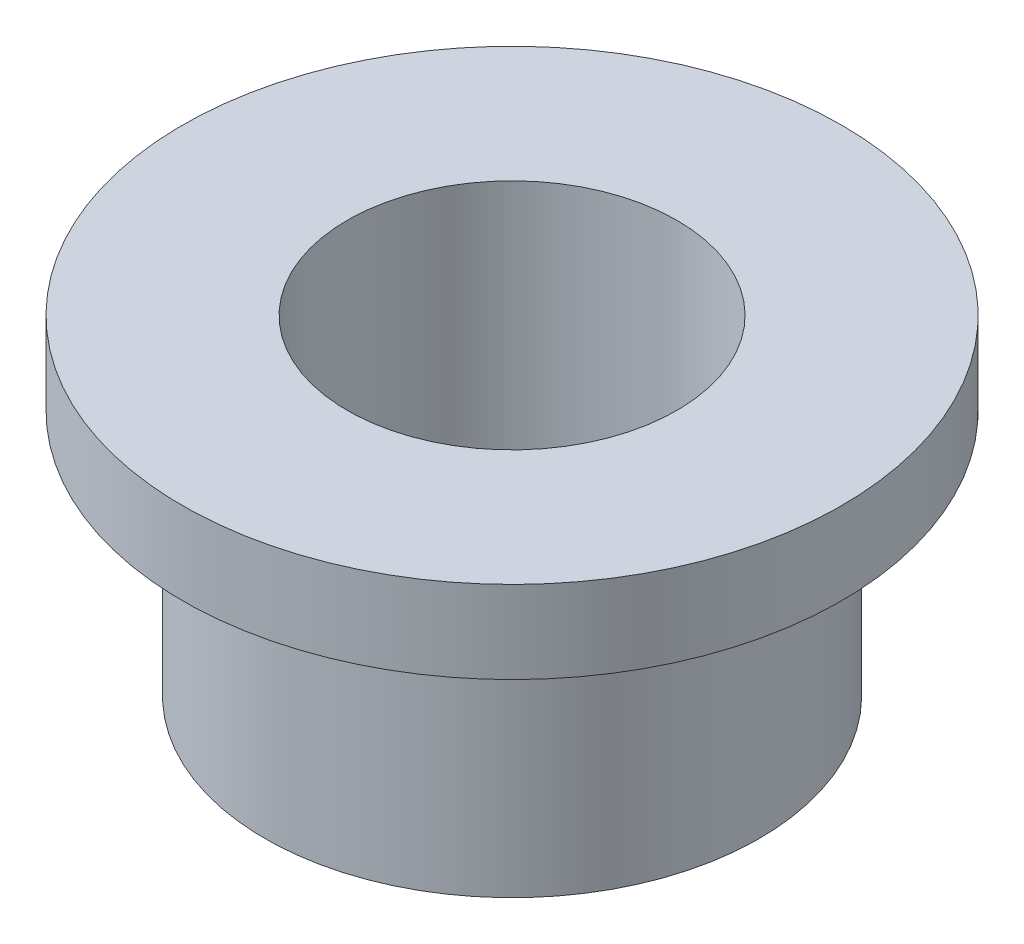
ISO-10303-21;
HEADER;
FILE_DESCRIPTION(('STEP AP214'),'2;1');
FILE_NAME('part.step','',(''),(''),'','','');
FILE_SCHEMA(('AUTOMOTIVE_DESIGN { 1 0 10303 214 1 1 1 1 }'));
ENDSEC;
DATA;
#1=APPLICATION_CONTEXT('core data for automotive mechanical design processes');
#2=APPLICATION_PROTOCOL_DEFINITION('international standard','automotive_design',2000,#1);
#3=PRODUCT_CONTEXT('',#1,'mechanical');
#4=PRODUCT('Part','Part','',(#3));
#5=PRODUCT_RELATED_PRODUCT_CATEGORY('part','',(#4));
#6=PRODUCT_DEFINITION_FORMATION('','',#4);
#7=PRODUCT_DEFINITION_CONTEXT('part definition',#1,'design');
#8=PRODUCT_DEFINITION('design','',#6,#7);
#9=PRODUCT_DEFINITION_SHAPE('','',#8);
#10=(LENGTH_UNIT() NAMED_UNIT(*) SI_UNIT(.MILLI.,.METRE.));
#11=(NAMED_UNIT(*) PLANE_ANGLE_UNIT() SI_UNIT($,.RADIAN.));
#12=(NAMED_UNIT(*) SI_UNIT($,.STERADIAN.) SOLID_ANGLE_UNIT());
#13=UNCERTAINTY_MEASURE_WITH_UNIT(LENGTH_MEASURE(1.E-05),#10,'distance_accuracy_value','');
#14=(GEOMETRIC_REPRESENTATION_CONTEXT(3) GLOBAL_UNCERTAINTY_ASSIGNED_CONTEXT((#13)) GLOBAL_UNIT_ASSIGNED_CONTEXT((#10,
#11,#12)) REPRESENTATION_CONTEXT('',''));
#15=CARTESIAN_POINT('',(0.,0.,0.));
#16=DIRECTION('',(0.,0.,1.));
#17=DIRECTION('',(1.,0.,0.));
#18=AXIS2_PLACEMENT_3D('',#15,#16,#17);
#19=CARTESIAN_POINT('',(1.,1.5,0.));
#20=DIRECTION('',(0.,-1.,0.));
#21=DIRECTION('',(0.,0.,-1.));
#22=AXIS2_PLACEMENT_3D('',#19,#20,#21);
#23=PLANE('',#22);
#24=CARTESIAN_POINT('',(0.,1.5,0.));
#25=DIRECTION('',(0.,-1.,0.));
#26=DIRECTION('',(0.,0.,-1.));
#27=AXIS2_PLACEMENT_3D('',#24,#25,#26);
#28=CIRCLE('',#27,2.);
#29=CARTESIAN_POINT('',(0.,1.5,-2.));
#30=VERTEX_POINT('',#29);
#31=EDGE_CURVE('E52',#30,#30,#28,.T.);
#32=ORIENTED_EDGE('',*,*,#31,.T.);
#33=EDGE_LOOP('',(#32));
#34=FACE_BOUND('',#33,.T.);
#35=CARTESIAN_POINT('',(0.,1.5,0.));
#36=DIRECTION('',(0.,-1.,0.));
#37=DIRECTION('',(0.,0.,-1.));
#38=AXIS2_PLACEMENT_3D('',#35,#36,#37);
#39=CIRCLE('',#38,1.5);
#40=CARTESIAN_POINT('',(0.,1.5,-1.5));
#41=VERTEX_POINT('',#40);
#42=EDGE_CURVE('E10',#41,#41,#39,.T.);
#43=ORIENTED_EDGE('',*,*,#42,.F.);
#44=EDGE_LOOP('',(#43));
#45=FACE_BOUND('',#44,.T.);
#46=ADVANCED_FACE('F30',(#34,#45),#23,.T.);
#47=CARTESIAN_POINT('',(0.,0.,0.));
#48=DIRECTION('',(0.,-1.,0.));
#49=DIRECTION('',(0.,0.,-1.));
#50=AXIS2_PLACEMENT_3D('',#47,#48,#49);
#51=CYLINDRICAL_SURFACE('',#50,1.5);
#52=ORIENTED_EDGE('',*,*,#42,.T.);
#53=EDGE_LOOP('',(#52));
#54=FACE_BOUND('',#53,.T.);
#55=CARTESIAN_POINT('',(0.,0.,0.));
#56=DIRECTION('',(0.,-1.,0.));
#57=DIRECTION('',(0.,0.,-1.));
#58=AXIS2_PLACEMENT_3D('',#55,#56,#57);
#59=CIRCLE('',#58,1.5);
#60=CARTESIAN_POINT('',(0.,0.,-1.5));
#61=VERTEX_POINT('',#60);
#62=EDGE_CURVE('E36',#61,#61,#59,.T.);
#63=ORIENTED_EDGE('',*,*,#62,.F.);
#64=EDGE_LOOP('',(#63));
#65=FACE_BOUND('',#64,.T.);
#66=ADVANCED_FACE('F78',(#54,#65),#51,.T.);
#67=CARTESIAN_POINT('',(1.5,0.,0.));
#68=DIRECTION('',(0.,1.,0.));
#69=DIRECTION('',(0.,0.,1.));
#70=AXIS2_PLACEMENT_3D('',#67,#68,#69);
#71=PLANE('',#70);
#72=CARTESIAN_POINT('',(0.,0.,0.));
#73=DIRECTION('',(0.,-1.,0.));
#74=DIRECTION('',(0.,0.,-1.));
#75=AXIS2_PLACEMENT_3D('',#72,#73,#74);
#76=CIRCLE('',#75,1.);
#77=CARTESIAN_POINT('',(0.,0.,-1.));
#78=VERTEX_POINT('',#77);
#79=EDGE_CURVE('E40',#78,#78,#76,.T.);
#80=ORIENTED_EDGE('',*,*,#79,.F.);
#81=EDGE_LOOP('',(#80));
#82=FACE_BOUND('',#81,.T.);
#83=ORIENTED_EDGE('',*,*,#62,.T.);
#84=EDGE_LOOP('',(#83));
#85=FACE_BOUND('',#84,.T.);
#86=ADVANCED_FACE('F73',(#82,#85),#71,.F.);
#87=CARTESIAN_POINT('',(0.,0.,0.));
#88=DIRECTION('',(0.,-1.,0.));
#89=DIRECTION('',(0.,0.,-1.));
#90=AXIS2_PLACEMENT_3D('',#87,#88,#89);
#91=CYLINDRICAL_SURFACE('',#90,1.);
#92=CARTESIAN_POINT('',(0.,2.,0.));
#93=DIRECTION('',(0.,-1.,0.));
#94=DIRECTION('',(0.,0.,-1.));
#95=AXIS2_PLACEMENT_3D('',#92,#93,#94);
#96=CIRCLE('',#95,1.);
#97=CARTESIAN_POINT('',(0.,2.,-1.));
#98=VERTEX_POINT('',#97);
#99=EDGE_CURVE('E44',#98,#98,#96,.T.);
#100=ORIENTED_EDGE('',*,*,#99,.F.);
#101=EDGE_LOOP('',(#100));
#102=FACE_BOUND('',#101,.T.);
#103=ORIENTED_EDGE('',*,*,#79,.T.);
#104=EDGE_LOOP('',(#103));
#105=FACE_BOUND('',#104,.T.);
#106=ADVANCED_FACE('F67',(#102,#105),#91,.F.);
#107=CARTESIAN_POINT('',(1.,2.,0.));
#108=DIRECTION('',(0.,-1.,0.));
#109=DIRECTION('',(0.,0.,-1.));
#110=AXIS2_PLACEMENT_3D('',#107,#108,#109);
#111=PLANE('',#110);
#112=CARTESIAN_POINT('',(0.,2.,0.));
#113=DIRECTION('',(0.,-1.,0.));
#114=DIRECTION('',(0.,0.,-1.));
#115=AXIS2_PLACEMENT_3D('',#112,#113,#114);
#116=CIRCLE('',#115,2.);
#117=CARTESIAN_POINT('',(0.,2.,-2.));
#118=VERTEX_POINT('',#117);
#119=EDGE_CURVE('E49',#118,#118,#116,.T.);
#120=ORIENTED_EDGE('',*,*,#119,.F.);
#121=EDGE_LOOP('',(#120));
#122=FACE_BOUND('',#121,.T.);
#123=ORIENTED_EDGE('',*,*,#99,.T.);
#124=EDGE_LOOP('',(#123));
#125=FACE_BOUND('',#124,.T.);
#126=ADVANCED_FACE('F61',(#122,#125),#111,.F.);
#127=CARTESIAN_POINT('',(0.,0.,0.));
#128=DIRECTION('',(0.,-1.,0.));
#129=DIRECTION('',(0.,0.,-1.));
#130=AXIS2_PLACEMENT_3D('',#127,#128,#129);
#131=CYLINDRICAL_SURFACE('',#130,2.);
#132=ORIENTED_EDGE('',*,*,#31,.F.);
#133=EDGE_LOOP('',(#132));
#134=FACE_BOUND('',#133,.T.);
#135=ORIENTED_EDGE('',*,*,#119,.T.);
#136=EDGE_LOOP('',(#135));
#137=FACE_BOUND('',#136,.T.);
#138=ADVANCED_FACE('F58',(#134,#137),#131,.T.);
#139=CLOSED_SHELL('',(#46,#66,#86,#106,#126,#138));
#140=MANIFOLD_SOLID_BREP('B2',#139);
#141=ADVANCED_BREP_SHAPE_REPRESENTATION('',(#18,#140),#14);
#142=SHAPE_DEFINITION_REPRESENTATION(#9,#141);
ENDSEC;
END-ISO-10303-21;
